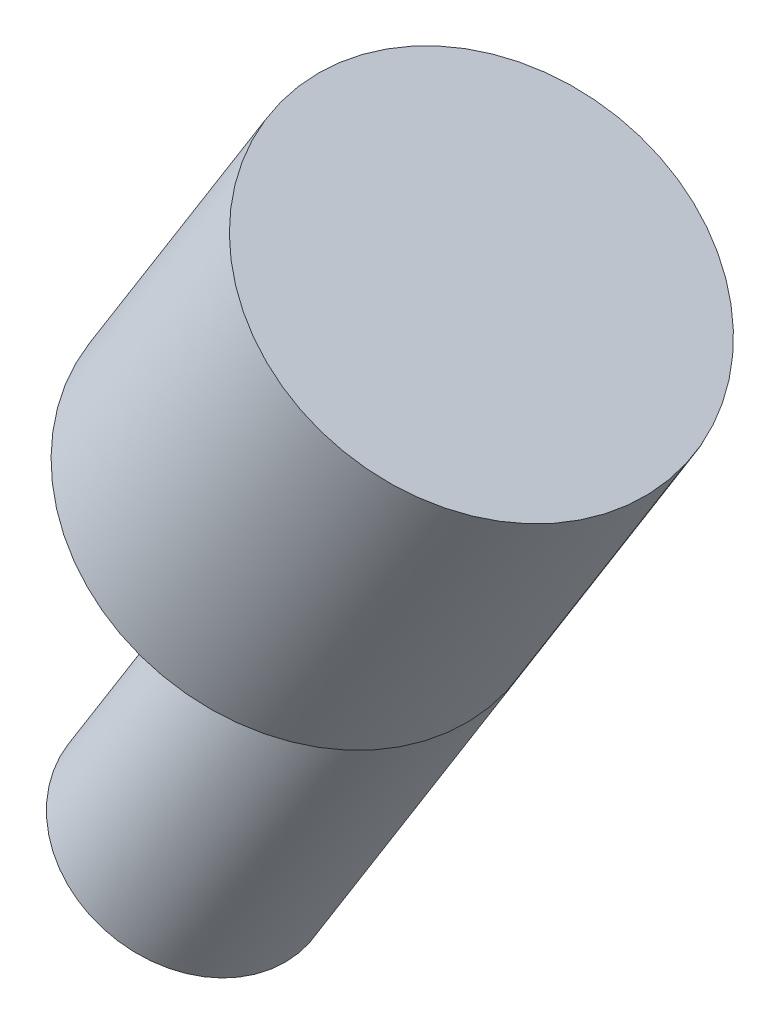
ISO-10303-21;
HEADER;
FILE_DESCRIPTION(('STEP AP214'),'2;1');
FILE_NAME('part.step','',(''),(''),'','','');
FILE_SCHEMA(('AUTOMOTIVE_DESIGN { 1 0 10303 214 1 1 1 1 }'));
ENDSEC;
DATA;
#1=APPLICATION_CONTEXT('core data for automotive mechanical design processes');
#2=APPLICATION_PROTOCOL_DEFINITION('international standard','automotive_design',2000,#1);
#3=PRODUCT_CONTEXT('',#1,'mechanical');
#4=PRODUCT('Part','Part','',(#3));
#5=PRODUCT_RELATED_PRODUCT_CATEGORY('part','',(#4));
#6=PRODUCT_DEFINITION_FORMATION('','',#4);
#7=PRODUCT_DEFINITION_CONTEXT('part definition',#1,'design');
#8=PRODUCT_DEFINITION('design','',#6,#7);
#9=PRODUCT_DEFINITION_SHAPE('','',#8);
#10=(LENGTH_UNIT() NAMED_UNIT(*) SI_UNIT(.MILLI.,.METRE.));
#11=(NAMED_UNIT(*) PLANE_ANGLE_UNIT() SI_UNIT($,.RADIAN.));
#12=(NAMED_UNIT(*) SI_UNIT($,.STERADIAN.) SOLID_ANGLE_UNIT());
#13=UNCERTAINTY_MEASURE_WITH_UNIT(LENGTH_MEASURE(1.E-05),#10,'distance_accuracy_value','');
#14=(GEOMETRIC_REPRESENTATION_CONTEXT(3) GLOBAL_UNCERTAINTY_ASSIGNED_CONTEXT((#13)) GLOBAL_UNIT_ASSIGNED_CONTEXT((#10,
#11,#12)) REPRESENTATION_CONTEXT('',''));
#15=CARTESIAN_POINT('',(0.,0.,0.));
#16=DIRECTION('',(0.,0.,1.));
#17=DIRECTION('',(1.,0.,0.));
#18=AXIS2_PLACEMENT_3D('',#15,#16,#17);
#19=CARTESIAN_POINT('',(-12.2332571005123,34.8029756280648,-165.));
#20=DIRECTION('',(-0.529998940006732,-0.847998304002868,0.));
#21=DIRECTION('',(0.847998304002868,-0.529998940006732,0.));
#22=AXIS2_PLACEMENT_3D('',#19,#20,#21);
#23=CYLINDRICAL_SURFACE('',#22,2.3);
#24=CARTESIAN_POINT('',(-15.6811028699163,29.2864223970697,-165.));
#25=DIRECTION('',(-0.529998940006732,-0.847998304002868,0.));
#26=DIRECTION('',(0.847998304002868,-0.529998940006732,0.));
#27=AXIS2_PLACEMENT_3D('',#24,#25,#26);
#28=CIRCLE('',#27,2.3);
#29=CARTESIAN_POINT('',(-16.8277959364155,30.0031055636383,-163.1395));
#30=VERTEX_POINT('',#29);
#31=CARTESIAN_POINT('',(-14.5344098034172,28.569739230501,-163.1395));
#32=VERTEX_POINT('',#31);
#33=EDGE_CURVE('E11',#30,#32,#28,.F.);
#34=ORIENTED_EDGE('',*,*,#33,.F.);
#35=EDGE_CURVE('E44',#32,#30,#28,.F.);
#36=ORIENTED_EDGE('',*,*,#35,.F.);
#37=EDGE_LOOP('',(#34,#36));
#38=FACE_BOUND('',#37,.T.);
#39=CARTESIAN_POINT('',(-23.6310869700173,16.5664478370266,-165.));
#40=DIRECTION('',(-0.529998940006732,-0.847998304002868,0.));
#41=DIRECTION('',(0.847998304002868,-0.529998940006732,0.));
#42=AXIS2_PLACEMENT_3D('',#39,#40,#41);
#43=CIRCLE('',#42,2.3);
#44=CARTESIAN_POINT('',(-21.6806908708107,15.3474502750111,-165.));
#45=VERTEX_POINT('',#44);
#46=EDGE_CURVE('E59',#45,#45,#43,.T.);
#47=ORIENTED_EDGE('',*,*,#46,.F.);
#48=EDGE_LOOP('',(#47));
#49=FACE_BOUND('',#48,.T.);
#50=ADVANCED_FACE('F37',(#38,#49),#23,.T.);
#51=CARTESIAN_POINT('',(-23.6310869700173,16.5664478370266,-165.));
#52=DIRECTION('',(-0.529998940006732,-0.847998304002868,0.));
#53=DIRECTION('',(0.847998304002868,-0.529998940006732,0.));
#54=AXIS2_PLACEMENT_3D('',#51,#52,#53);
#55=PLANE('',#54);
#56=ORIENTED_EDGE('',*,*,#46,.T.);
#57=EDGE_LOOP('',(#56));
#58=FACE_BOUND('',#57,.T.);
#59=ADVANCED_FACE('F71',(#58),#55,.T.);
#60=CARTESIAN_POINT('',(-15.6811028699163,29.2864223970697,-159.375));
#61=DIRECTION('',(-0.529998940006732,-0.847998304002868,0.));
#62=DIRECTION('',(0.847998304002868,-0.529998940006732,0.));
#63=AXIS2_PLACEMENT_3D('',#60,#61,#62);
#64=PLANE('',#63);
#65=CARTESIAN_POINT('',(-15.6811028699163,29.2864223970697,-159.375));
#66=DIRECTION('',(0.529998940006732,0.847998304002868,0.));
#67=DIRECTION('',(-0.847998304002868,0.529998940006732,0.));
#68=AXIS2_PLACEMENT_3D('',#65,#66,#67);
#69=CIRCLE('',#68,4.);
#70=EDGE_CURVE('E50',#32,#30,#69,.T.);
#71=ORIENTED_EDGE('',*,*,#70,.F.);
#72=ORIENTED_EDGE('',*,*,#35,.T.);
#73=EDGE_LOOP('',(#71,#72));
#74=FACE_BOUND('',#73,.T.);
#75=ADVANCED_FACE('F58',(#74),#64,.F.);
#76=CARTESIAN_POINT('',(-15.6811028699163,29.2864223970697,-159.375));
#77=DIRECTION('',(0.529998940006732,0.847998304002868,0.));
#78=DIRECTION('',(-0.847998304002868,0.529998940006732,0.));
#79=AXIS2_PLACEMENT_3D('',#76,#77,#78);
#80=PLANE('',#79);
#81=EDGE_CURVE('E60',#30,#32,#69,.T.);
#82=ORIENTED_EDGE('',*,*,#81,.F.);
#83=ORIENTED_EDGE('',*,*,#33,.T.);
#84=EDGE_LOOP('',(#82,#83));
#85=FACE_BOUND('',#84,.T.);
#86=ADVANCED_FACE('F61',(#85),#80,.F.);
#87=CARTESIAN_POINT('',(-11.9711102898692,35.2224105250897,-159.375));
#88=DIRECTION('',(-0.529998940006732,-0.847998304002868,0.));
#89=DIRECTION('',(0.847998304002868,-0.529998940006732,0.));
#90=AXIS2_PLACEMENT_3D('',#87,#88,#89);
#91=CYLINDRICAL_SURFACE('',#90,4.);
#92=CARTESIAN_POINT('',(-11.9711102898692,35.2224105250897,-159.375));
#93=DIRECTION('',(0.529998940006732,0.847998304002868,0.));
#94=DIRECTION('',(-0.847998304002868,0.529998940006732,0.));
#95=AXIS2_PLACEMENT_3D('',#92,#93,#94);
#96=CIRCLE('',#95,4.);
#97=CARTESIAN_POINT('',(-15.3631035058807,37.3424062851167,-159.375));
#98=VERTEX_POINT('',#97);
#99=EDGE_CURVE('E65',#98,#98,#96,.T.);
#100=ORIENTED_EDGE('',*,*,#99,.F.);
#101=EDGE_LOOP('',(#100));
#102=FACE_BOUND('',#101,.T.);
#103=ORIENTED_EDGE('',*,*,#70,.T.);
#104=ORIENTED_EDGE('',*,*,#81,.T.);
#105=EDGE_LOOP('',(#103,#104));
#106=FACE_BOUND('',#105,.T.);
#107=ADVANCED_FACE('F64',(#102,#106),#91,.T.);
#108=CARTESIAN_POINT('',(-11.9711102898692,35.2224105250897,-159.375));
#109=DIRECTION('',(0.529998940006732,0.847998304002868,0.));
#110=DIRECTION('',(-0.847998304002868,0.529998940006732,0.));
#111=AXIS2_PLACEMENT_3D('',#108,#109,#110);
#112=PLANE('',#111);
#113=ORIENTED_EDGE('',*,*,#99,.T.);
#114=EDGE_LOOP('',(#113));
#115=FACE_BOUND('',#114,.T.);
#116=ADVANCED_FACE('F83',(#115),#112,.T.);
#117=CLOSED_SHELL('',(#50,#59,#75,#86,#107,#116));
#118=MANIFOLD_SOLID_BREP('B2',#117);
#119=ADVANCED_BREP_SHAPE_REPRESENTATION('',(#18,#118),#14);
#120=SHAPE_DEFINITION_REPRESENTATION(#9,#119);
ENDSEC;
END-ISO-10303-21;
